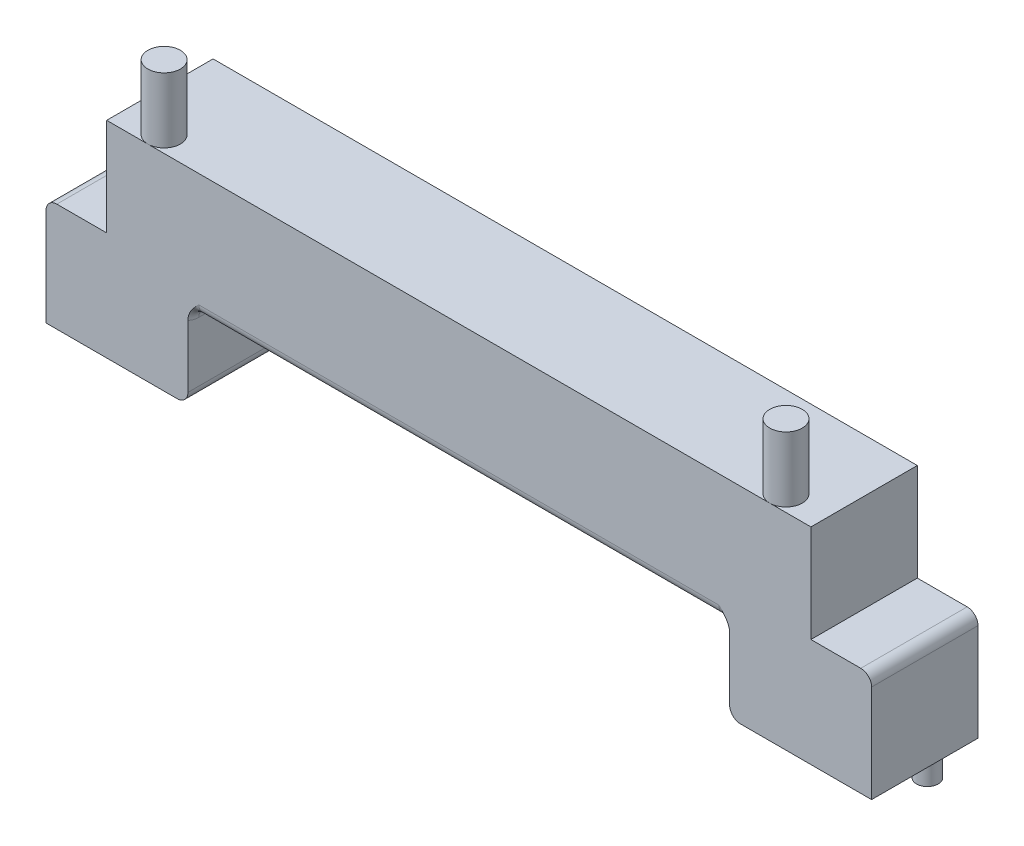
ISO-10303-21;
HEADER;
FILE_DESCRIPTION(('STEP AP214'),'2;1');
FILE_NAME('part.step','',(''),(''),'','','');
FILE_SCHEMA(('AUTOMOTIVE_DESIGN { 1 0 10303 214 1 1 1 1 }'));
ENDSEC;
DATA;
#1=APPLICATION_CONTEXT('core data for automotive mechanical design processes');
#2=APPLICATION_PROTOCOL_DEFINITION('international standard','automotive_design',2000,#1);
#3=PRODUCT_CONTEXT('',#1,'mechanical');
#4=PRODUCT('Part','Part','',(#3));
#5=PRODUCT_RELATED_PRODUCT_CATEGORY('part','',(#4));
#6=PRODUCT_DEFINITION_FORMATION('','',#4);
#7=PRODUCT_DEFINITION_CONTEXT('part definition',#1,'design');
#8=PRODUCT_DEFINITION('design','',#6,#7);
#9=PRODUCT_DEFINITION_SHAPE('','',#8);
#10=(LENGTH_UNIT() NAMED_UNIT(*) SI_UNIT(.MILLI.,.METRE.));
#11=(NAMED_UNIT(*) PLANE_ANGLE_UNIT() SI_UNIT($,.RADIAN.));
#12=(NAMED_UNIT(*) SI_UNIT($,.STERADIAN.) SOLID_ANGLE_UNIT());
#13=UNCERTAINTY_MEASURE_WITH_UNIT(LENGTH_MEASURE(1.E-05),#10,'distance_accuracy_value','');
#14=(GEOMETRIC_REPRESENTATION_CONTEXT(3) GLOBAL_UNCERTAINTY_ASSIGNED_CONTEXT((#13)) GLOBAL_UNIT_ASSIGNED_CONTEXT((#10,
#11,#12)) REPRESENTATION_CONTEXT('',''));
#15=CARTESIAN_POINT('',(0.,0.,0.));
#16=DIRECTION('',(0.,0.,1.));
#17=DIRECTION('',(1.,0.,0.));
#18=AXIS2_PLACEMENT_3D('',#15,#16,#17);
#19=CARTESIAN_POINT('',(63.1,0.,-9.82));
#20=DIRECTION('',(0.,-1.,0.));
#21=DIRECTION('',(0.,0.,-1.));
#22=AXIS2_PLACEMENT_3D('',#19,#20,#21);
#23=PLANE('',#22);
#24=CARTESIAN_POINT('',(73.025,0.,-8.32));
#25=DIRECTION('',(0.,-1.,0.));
#26=DIRECTION('',(0.,0.,-1.));
#27=AXIS2_PLACEMENT_3D('',#24,#25,#26);
#28=CIRCLE('',#27,0.999999999999998);
#29=CARTESIAN_POINT('',(73.025,0.,-9.32));
#30=VERTEX_POINT('',#29);
#31=EDGE_CURVE('E710',#30,#30,#28,.T.);
#32=ORIENTED_EDGE('',*,*,#31,.F.);
#33=EDGE_LOOP('',(#32));
#34=FACE_BOUND('',#33,.T.);
#35=DIRECTION('',(1.,0.,0.));
#36=VECTOR('',#35,1.);
#37=CARTESIAN_POINT('',(63.1,0.,0.));
#38=LINE('',#37,#36);
#39=CARTESIAN_POINT('',(64.1,0.,0.));
#40=VERTEX_POINT('',#39);
#41=CARTESIAN_POINT('',(76.2,0.,0.));
#42=VERTEX_POINT('',#41);
#43=EDGE_CURVE('E441',#40,#42,#38,.T.);
#44=ORIENTED_EDGE('',*,*,#43,.F.);
#45=DIRECTION('',(0.,0.,1.));
#46=VECTOR('',#45,1.);
#47=CARTESIAN_POINT('',(64.1,0.,-9.82));
#48=LINE('',#47,#46);
#49=CARTESIAN_POINT('',(64.1,0.,-9.82));
#50=VERTEX_POINT('',#49);
#51=EDGE_CURVE('E279',#40,#50,#48,.F.);
#52=ORIENTED_EDGE('',*,*,#51,.T.);
#53=DIRECTION('',(1.,0.,0.));
#54=VECTOR('',#53,1.);
#55=CARTESIAN_POINT('',(63.1,0.,-9.82));
#56=LINE('',#55,#54);
#57=CARTESIAN_POINT('',(76.2,0.,-9.82));
#58=VERTEX_POINT('',#57);
#59=EDGE_CURVE('E224',#50,#58,#56,.T.);
#60=ORIENTED_EDGE('',*,*,#59,.T.);
#61=DIRECTION('',(0.,0.,1.));
#62=VECTOR('',#61,1.);
#63=CARTESIAN_POINT('',(76.2,0.,-9.82));
#64=LINE('',#63,#62);
#65=EDGE_CURVE('E239',#58,#42,#64,.T.);
#66=ORIENTED_EDGE('',*,*,#65,.T.);
#67=EDGE_LOOP('',(#44,#52,#60,#66));
#68=FACE_BOUND('',#67,.T.);
#69=ADVANCED_FACE('F41',(#34,#68),#23,.T.);
#70=CARTESIAN_POINT('',(63.1,0.,-9.82));
#71=DIRECTION('',(-1.,0.,0.));
#72=DIRECTION('',(0.,0.,1.));
#73=AXIS2_PLACEMENT_3D('',#70,#71,#72);
#74=PLANE('',#73);
#75=DIRECTION('',(0.,-1.,0.));
#76=VECTOR('',#75,1.);
#77=CARTESIAN_POINT('',(63.1,0.,0.));
#78=LINE('',#77,#76);
#79=CARTESIAN_POINT('',(63.1,6.76794919243112,0.));
#80=VERTEX_POINT('',#79);
#81=CARTESIAN_POINT('',(63.1,1.,0.));
#82=VERTEX_POINT('',#81);
#83=EDGE_CURVE('E222',#80,#82,#78,.T.);
#84=ORIENTED_EDGE('',*,*,#83,.F.);
#85=CARTESIAN_POINT('',(63.1,8.5,-1.));
#86=DIRECTION('',(-1.,0.,0.));
#87=DIRECTION('',(0.,0.,1.));
#88=AXIS2_PLACEMENT_3D('',#85,#86,#87);
#89=CIRCLE('',#88,2.);
#90=CARTESIAN_POINT('',(63.1,6.5,-1.));
#91=VERTEX_POINT('',#90);
#92=EDGE_CURVE('E264',#80,#91,#89,.F.);
#93=ORIENTED_EDGE('',*,*,#92,.T.);
#94=DIRECTION('',(0.,0.,1.));
#95=VECTOR('',#94,1.);
#96=CARTESIAN_POINT('',(63.1,6.5,-9.82));
#97=LINE('',#96,#95);
#98=CARTESIAN_POINT('',(63.1,6.5,-9.82));
#99=VERTEX_POINT('',#98);
#100=EDGE_CURVE('E262',#91,#99,#97,.F.);
#101=ORIENTED_EDGE('',*,*,#100,.T.);
#102=DIRECTION('',(0.,-1.,0.));
#103=VECTOR('',#102,1.);
#104=CARTESIAN_POINT('',(63.1,0.,-9.82));
#105=LINE('',#104,#103);
#106=CARTESIAN_POINT('',(63.1,1.,-9.82));
#107=VERTEX_POINT('',#106);
#108=EDGE_CURVE('E242',#99,#107,#105,.T.);
#109=ORIENTED_EDGE('',*,*,#108,.T.);
#110=DIRECTION('',(0.,0.,1.));
#111=VECTOR('',#110,1.);
#112=CARTESIAN_POINT('',(63.1,1.,-9.82));
#113=LINE('',#112,#111);
#114=EDGE_CURVE('E259',#107,#82,#113,.T.);
#115=ORIENTED_EDGE('',*,*,#114,.T.);
#116=EDGE_LOOP('',(#84,#93,#101,#109,#115));
#117=FACE_BOUND('',#116,.T.);
#118=ADVANCED_FACE('F354',(#117),#74,.T.);
#119=CARTESIAN_POINT('',(13.1,7.5,-9.82));
#120=DIRECTION('',(0.,-1.,0.));
#121=DIRECTION('',(0.,0.,-1.));
#122=AXIS2_PLACEMENT_3D('',#119,#120,#121);
#123=PLANE('',#122);
#124=DIRECTION('',(1.,0.,0.));
#125=VECTOR('',#124,1.);
#126=CARTESIAN_POINT('',(13.1,7.5,-1.));
#127=LINE('',#126,#125);
#128=CARTESIAN_POINT('',(62.1,7.5,-1.));
#129=VERTEX_POINT('',#128);
#130=CARTESIAN_POINT('',(14.1,7.5,-1.));
#131=VERTEX_POINT('',#130);
#132=EDGE_CURVE('E245',#129,#131,#127,.F.);
#133=ORIENTED_EDGE('',*,*,#132,.T.);
#134=DIRECTION('',(0.,0.,1.));
#135=VECTOR('',#134,1.);
#136=CARTESIAN_POINT('',(14.1,7.5,-9.82));
#137=LINE('',#136,#135);
#138=CARTESIAN_POINT('',(14.1,7.5,-9.82));
#139=VERTEX_POINT('',#138);
#140=EDGE_CURVE('E269',#131,#139,#137,.F.);
#141=ORIENTED_EDGE('',*,*,#140,.T.);
#142=DIRECTION('',(1.,0.,0.));
#143=VECTOR('',#142,1.);
#144=CARTESIAN_POINT('',(13.1,7.5,-9.82));
#145=LINE('',#144,#143);
#146=CARTESIAN_POINT('',(62.1,7.5,-9.82));
#147=VERTEX_POINT('',#146);
#148=EDGE_CURVE('E435',#139,#147,#145,.T.);
#149=ORIENTED_EDGE('',*,*,#148,.T.);
#150=DIRECTION('',(0.,0.,1.));
#151=VECTOR('',#150,1.);
#152=CARTESIAN_POINT('',(62.1,7.5,-0.999999999999999));
#153=LINE('',#152,#151);
#154=EDGE_CURVE('E267',#147,#129,#153,.T.);
#155=ORIENTED_EDGE('',*,*,#154,.T.);
#156=EDGE_LOOP('',(#133,#141,#149,#155));
#157=FACE_BOUND('',#156,.T.);
#158=ADVANCED_FACE('F360',(#157),#123,.T.);
#159=CARTESIAN_POINT('',(13.1,0.,-9.82));
#160=DIRECTION('',(1.,0.,0.));
#161=DIRECTION('',(0.,1.,0.));
#162=AXIS2_PLACEMENT_3D('',#159,#160,#161);
#163=PLANE('',#162);
#164=DIRECTION('',(0.,0.,1.));
#165=VECTOR('',#164,1.);
#166=CARTESIAN_POINT('',(13.1,6.5,-0.999999999999999));
#167=LINE('',#166,#165);
#168=CARTESIAN_POINT('',(13.1,6.5,-9.82));
#169=VERTEX_POINT('',#168);
#170=CARTESIAN_POINT('',(13.1,6.5,-1.));
#171=VERTEX_POINT('',#170);
#172=EDGE_CURVE('E250',#169,#171,#167,.T.);
#173=ORIENTED_EDGE('',*,*,#172,.T.);
#174=CARTESIAN_POINT('',(13.1,8.5,-1.));
#175=DIRECTION('',(1.,0.,0.));
#176=DIRECTION('',(0.,1.,0.));
#177=AXIS2_PLACEMENT_3D('',#174,#175,#176);
#178=CIRCLE('',#177,2.);
#179=CARTESIAN_POINT('',(13.1,6.76794919243112,0.));
#180=VERTEX_POINT('',#179);
#181=EDGE_CURVE('E252',#171,#180,#178,.F.);
#182=ORIENTED_EDGE('',*,*,#181,.T.);
#183=DIRECTION('',(0.,1.,0.));
#184=VECTOR('',#183,1.);
#185=CARTESIAN_POINT('',(13.1,0.,0.));
#186=LINE('',#185,#184);
#187=CARTESIAN_POINT('',(13.1,1.,0.));
#188=VERTEX_POINT('',#187);
#189=EDGE_CURVE('E219',#188,#180,#186,.T.);
#190=ORIENTED_EDGE('',*,*,#189,.F.);
#191=DIRECTION('',(0.,0.,1.));
#192=VECTOR('',#191,1.);
#193=CARTESIAN_POINT('',(13.1,1.,-9.82));
#194=LINE('',#193,#192);
#195=CARTESIAN_POINT('',(13.1,1.,-9.82));
#196=VERTEX_POINT('',#195);
#197=EDGE_CURVE('E248',#188,#196,#194,.F.);
#198=ORIENTED_EDGE('',*,*,#197,.T.);
#199=DIRECTION('',(0.,1.,0.));
#200=VECTOR('',#199,1.);
#201=CARTESIAN_POINT('',(13.1,0.,-9.82));
#202=LINE('',#201,#200);
#203=EDGE_CURVE('E437',#196,#169,#202,.T.);
#204=ORIENTED_EDGE('',*,*,#203,.T.);
#205=EDGE_LOOP('',(#173,#182,#190,#198,#204));
#206=FACE_BOUND('',#205,.T.);
#207=ADVANCED_FACE('F394',(#206),#163,.T.);
#208=CARTESIAN_POINT('',(0.,0.,-9.82));
#209=DIRECTION('',(0.,-1.,0.));
#210=DIRECTION('',(0.,0.,-1.));
#211=AXIS2_PLACEMENT_3D('',#208,#209,#210);
#212=PLANE('',#211);
#213=CARTESIAN_POINT('',(3.175,0.,-8.32));
#214=DIRECTION('',(0.,-1.,0.));
#215=DIRECTION('',(0.,0.,1.));
#216=AXIS2_PLACEMENT_3D('',#213,#214,#215);
#217=CIRCLE('',#216,0.999999999999998);
#218=CARTESIAN_POINT('',(3.175,0.,-7.32));
#219=VERTEX_POINT('',#218);
#220=EDGE_CURVE('E419',#219,#219,#217,.T.);
#221=ORIENTED_EDGE('',*,*,#220,.F.);
#222=EDGE_LOOP('',(#221));
#223=FACE_BOUND('',#222,.T.);
#224=DIRECTION('',(1.,0.,0.));
#225=VECTOR('',#224,1.);
#226=CARTESIAN_POINT('',(0.,0.,-9.82));
#227=LINE('',#226,#225);
#228=CARTESIAN_POINT('',(0.,0.,-9.82));
#229=VERTEX_POINT('',#228);
#230=CARTESIAN_POINT('',(12.1,0.,-9.82));
#231=VERTEX_POINT('',#230);
#232=EDGE_CURVE('E469',#229,#231,#227,.T.);
#233=ORIENTED_EDGE('',*,*,#232,.T.);
#234=DIRECTION('',(0.,0.,1.));
#235=VECTOR('',#234,1.);
#236=CARTESIAN_POINT('',(12.1,0.,-9.82));
#237=LINE('',#236,#235);
#238=CARTESIAN_POINT('',(12.1,0.,0.));
#239=VERTEX_POINT('',#238);
#240=EDGE_CURVE('E288',#231,#239,#237,.T.);
#241=ORIENTED_EDGE('',*,*,#240,.T.);
#242=DIRECTION('',(1.,0.,0.));
#243=VECTOR('',#242,1.);
#244=CARTESIAN_POINT('',(0.,0.,0.));
#245=LINE('',#244,#243);
#246=CARTESIAN_POINT('',(0.,0.,0.));
#247=VERTEX_POINT('',#246);
#248=EDGE_CURVE('E216',#247,#239,#245,.T.);
#249=ORIENTED_EDGE('',*,*,#248,.F.);
#250=DIRECTION('',(0.,0.,1.));
#251=VECTOR('',#250,1.);
#252=CARTESIAN_POINT('',(0.,0.,-9.82));
#253=LINE('',#252,#251);
#254=EDGE_CURVE('E225',#229,#247,#253,.T.);
#255=ORIENTED_EDGE('',*,*,#254,.F.);
#256=EDGE_LOOP('',(#233,#241,#249,#255));
#257=FACE_BOUND('',#256,.T.);
#258=ADVANCED_FACE('F390',(#223,#257),#212,.T.);
#259=CARTESIAN_POINT('',(0.,10.,-9.82));
#260=DIRECTION('',(-1.,0.,0.));
#261=DIRECTION('',(0.,-1.,0.));
#262=AXIS2_PLACEMENT_3D('',#259,#260,#261);
#263=PLANE('',#262);
#264=DIRECTION('',(0.,-1.,0.));
#265=VECTOR('',#264,1.);
#266=CARTESIAN_POINT('',(0.,10.,0.));
#267=LINE('',#266,#265);
#268=CARTESIAN_POINT('',(0.,9.,0.));
#269=VERTEX_POINT('',#268);
#270=EDGE_CURVE('E214',#269,#247,#267,.T.);
#271=ORIENTED_EDGE('',*,*,#270,.F.);
#272=DIRECTION('',(0.,0.,1.));
#273=VECTOR('',#272,1.);
#274=CARTESIAN_POINT('',(0.,9.,-9.82));
#275=LINE('',#274,#273);
#276=CARTESIAN_POINT('',(0.,9.,-9.82));
#277=VERTEX_POINT('',#276);
#278=EDGE_CURVE('E294',#269,#277,#275,.F.);
#279=ORIENTED_EDGE('',*,*,#278,.T.);
#280=DIRECTION('',(0.,-1.,0.));
#281=VECTOR('',#280,1.);
#282=CARTESIAN_POINT('',(0.,10.,-9.82));
#283=LINE('',#282,#281);
#284=EDGE_CURVE('E467',#277,#229,#283,.T.);
#285=ORIENTED_EDGE('',*,*,#284,.T.);
#286=ORIENTED_EDGE('',*,*,#254,.T.);
#287=EDGE_LOOP('',(#271,#279,#285,#286));
#288=FACE_BOUND('',#287,.T.);
#289=ADVANCED_FACE('F386',(#288),#263,.T.);
#290=CARTESIAN_POINT('',(0.,10.,-9.82));
#291=DIRECTION('',(0.,1.,0.));
#292=DIRECTION('',(0.,0.,1.));
#293=AXIS2_PLACEMENT_3D('',#290,#291,#292);
#294=PLANE('',#293);
#295=DIRECTION('',(-1.,0.,0.));
#296=VECTOR('',#295,1.);
#297=CARTESIAN_POINT('',(0.,10.,-9.82));
#298=LINE('',#297,#296);
#299=CARTESIAN_POINT('',(5.6,10.,-9.82));
#300=VERTEX_POINT('',#299);
#301=CARTESIAN_POINT('',(0.999999999999998,10.,-9.82));
#302=VERTEX_POINT('',#301);
#303=EDGE_CURVE('E460',#300,#302,#298,.T.);
#304=ORIENTED_EDGE('',*,*,#303,.T.);
#305=DIRECTION('',(0.,0.,1.));
#306=VECTOR('',#305,1.);
#307=CARTESIAN_POINT('',(0.999999999999998,10.,-9.82));
#308=LINE('',#307,#306);
#309=CARTESIAN_POINT('',(0.999999999999998,10.,0.));
#310=VERTEX_POINT('',#309);
#311=EDGE_CURVE('E291',#302,#310,#308,.T.);
#312=ORIENTED_EDGE('',*,*,#311,.T.);
#313=DIRECTION('',(-1.,0.,0.));
#314=VECTOR('',#313,1.);
#315=CARTESIAN_POINT('',(0.,10.,0.));
#316=LINE('',#315,#314);
#317=CARTESIAN_POINT('',(5.6,10.,0.));
#318=VERTEX_POINT('',#317);
#319=EDGE_CURVE('E211',#318,#310,#316,.T.);
#320=ORIENTED_EDGE('',*,*,#319,.F.);
#321=DIRECTION('',(0.,0.,1.));
#322=VECTOR('',#321,1.);
#323=CARTESIAN_POINT('',(5.6,10.,-9.82));
#324=LINE('',#323,#322);
#325=EDGE_CURVE('E229',#300,#318,#324,.T.);
#326=ORIENTED_EDGE('',*,*,#325,.F.);
#327=EDGE_LOOP('',(#304,#312,#320,#326));
#328=FACE_BOUND('',#327,.T.);
#329=ADVANCED_FACE('F382',(#328),#294,.T.);
#330=CARTESIAN_POINT('',(5.6,10.,-9.82));
#331=DIRECTION('',(-1.,0.,0.));
#332=DIRECTION('',(0.,0.,1.));
#333=AXIS2_PLACEMENT_3D('',#330,#331,#332);
#334=PLANE('',#333);
#335=DIRECTION('',(0.,-1.,0.));
#336=VECTOR('',#335,1.);
#337=CARTESIAN_POINT('',(5.6,10.,0.));
#338=LINE('',#337,#336);
#339=CARTESIAN_POINT('',(5.6,19.,0.));
#340=VERTEX_POINT('',#339);
#341=EDGE_CURVE('E197',#340,#318,#338,.T.);
#342=ORIENTED_EDGE('',*,*,#341,.F.);
#343=DIRECTION('',(0.,0.,1.));
#344=VECTOR('',#343,1.);
#345=CARTESIAN_POINT('',(5.6,19.,-9.82));
#346=LINE('',#345,#344);
#347=CARTESIAN_POINT('',(5.6,19.,-9.82));
#348=VERTEX_POINT('',#347);
#349=EDGE_CURVE('E231',#348,#340,#346,.T.);
#350=ORIENTED_EDGE('',*,*,#349,.F.);
#351=DIRECTION('',(0.,-1.,0.));
#352=VECTOR('',#351,1.);
#353=CARTESIAN_POINT('',(5.6,10.,-9.82));
#354=LINE('',#353,#352);
#355=EDGE_CURVE('E458',#348,#300,#354,.T.);
#356=ORIENTED_EDGE('',*,*,#355,.T.);
#357=ORIENTED_EDGE('',*,*,#325,.T.);
#358=EDGE_LOOP('',(#342,#350,#356,#357));
#359=FACE_BOUND('',#358,.T.);
#360=ADVANCED_FACE('F379',(#359),#334,.T.);
#361=CARTESIAN_POINT('',(5.6,19.,-9.82));
#362=DIRECTION('',(0.,1.,0.));
#363=DIRECTION('',(0.,0.,1.));
#364=AXIS2_PLACEMENT_3D('',#361,#362,#363);
#365=PLANE('',#364);
#366=DIRECTION('',(-1.,0.,0.));
#367=VECTOR('',#366,1.);
#368=CARTESIAN_POINT('',(5.6,19.,0.));
#369=LINE('',#368,#367);
#370=CARTESIAN_POINT('',(9.4,19.,0.));
#371=VERTEX_POINT('',#370);
#372=EDGE_CURVE('E199',#371,#340,#369,.T.);
#373=ORIENTED_EDGE('',*,*,#372,.F.);
#374=CARTESIAN_POINT('',(9.4,19.,-1.5));
#375=DIRECTION('',(0.,1.,0.));
#376=DIRECTION('',(0.,0.,1.));
#377=AXIS2_PLACEMENT_3D('',#374,#375,#376);
#378=CIRCLE('',#377,1.5);
#379=EDGE_CURVE('E205',#371,#371,#378,.T.);
#380=ORIENTED_EDGE('',*,*,#379,.F.);
#381=CARTESIAN_POINT('',(66.8,19.,0.));
#382=VERTEX_POINT('',#381);
#383=EDGE_CURVE('E191',#382,#371,#369,.T.);
#384=ORIENTED_EDGE('',*,*,#383,.F.);
#385=CARTESIAN_POINT('',(66.8,19.,-1.5));
#386=DIRECTION('',(0.,1.,0.));
#387=DIRECTION('',(0.,0.,-1.));
#388=AXIS2_PLACEMENT_3D('',#385,#386,#387);
#389=CIRCLE('',#388,1.50000000000001);
#390=EDGE_CURVE('E203',#382,#382,#389,.T.);
#391=ORIENTED_EDGE('',*,*,#390,.F.);
#392=CARTESIAN_POINT('',(70.6,19.,0.));
#393=VERTEX_POINT('',#392);
#394=EDGE_CURVE('E187',#393,#382,#369,.T.);
#395=ORIENTED_EDGE('',*,*,#394,.F.);
#396=DIRECTION('',(0.,0.,1.));
#397=VECTOR('',#396,1.);
#398=CARTESIAN_POINT('',(70.6,19.,-9.82));
#399=LINE('',#398,#397);
#400=CARTESIAN_POINT('',(70.6,19.,-9.82));
#401=VERTEX_POINT('',#400);
#402=EDGE_CURVE('E234',#401,#393,#399,.T.);
#403=ORIENTED_EDGE('',*,*,#402,.F.);
#404=DIRECTION('',(-1.,0.,0.));
#405=VECTOR('',#404,1.);
#406=CARTESIAN_POINT('',(5.6,19.,-9.82));
#407=LINE('',#406,#405);
#408=EDGE_CURVE('E454',#401,#348,#407,.T.);
#409=ORIENTED_EDGE('',*,*,#408,.T.);
#410=ORIENTED_EDGE('',*,*,#349,.T.);
#411=EDGE_LOOP('',(#373,#380,#384,#391,#395,#403,#409,#410));
#412=FACE_BOUND('',#411,.T.);
#413=ADVANCED_FACE('F201',(#412),#365,.T.);
#414=CARTESIAN_POINT('',(70.6,19.,-9.82));
#415=DIRECTION('',(1.,0.,0.));
#416=DIRECTION('',(0.,0.,-1.));
#417=AXIS2_PLACEMENT_3D('',#414,#415,#416);
#418=PLANE('',#417);
#419=DIRECTION('',(0.,1.,0.));
#420=VECTOR('',#419,1.);
#421=CARTESIAN_POINT('',(70.6,19.,0.));
#422=LINE('',#421,#420);
#423=CARTESIAN_POINT('',(70.6,10.,0.));
#424=VERTEX_POINT('',#423);
#425=EDGE_CURVE('E194',#424,#393,#422,.T.);
#426=ORIENTED_EDGE('',*,*,#425,.F.);
#427=DIRECTION('',(0.,0.,1.));
#428=VECTOR('',#427,1.);
#429=CARTESIAN_POINT('',(70.6,10.,-9.82));
#430=LINE('',#429,#428);
#431=CARTESIAN_POINT('',(70.6,10.,-9.82));
#432=VERTEX_POINT('',#431);
#433=EDGE_CURVE('E236',#432,#424,#430,.T.);
#434=ORIENTED_EDGE('',*,*,#433,.F.);
#435=DIRECTION('',(0.,1.,0.));
#436=VECTOR('',#435,1.);
#437=CARTESIAN_POINT('',(70.6,19.,-9.82));
#438=LINE('',#437,#436);
#439=EDGE_CURVE('E451',#432,#401,#438,.T.);
#440=ORIENTED_EDGE('',*,*,#439,.T.);
#441=ORIENTED_EDGE('',*,*,#402,.T.);
#442=EDGE_LOOP('',(#426,#434,#440,#441));
#443=FACE_BOUND('',#442,.T.);
#444=ADVANCED_FACE('F373',(#443),#418,.T.);
#445=CARTESIAN_POINT('',(70.6,10.,-9.82));
#446=DIRECTION('',(0.,1.,0.));
#447=DIRECTION('',(0.,0.,1.));
#448=AXIS2_PLACEMENT_3D('',#445,#446,#447);
#449=PLANE('',#448);
#450=DIRECTION('',(-1.,0.,0.));
#451=VECTOR('',#450,1.);
#452=CARTESIAN_POINT('',(70.6,10.,0.));
#453=LINE('',#452,#451);
#454=CARTESIAN_POINT('',(75.2,10.,0.));
#455=VERTEX_POINT('',#454);
#456=EDGE_CURVE('E446',#455,#424,#453,.T.);
#457=ORIENTED_EDGE('',*,*,#456,.F.);
#458=DIRECTION('',(0.,0.,1.));
#459=VECTOR('',#458,1.);
#460=CARTESIAN_POINT('',(75.2,10.,-9.82));
#461=LINE('',#460,#459);
#462=CARTESIAN_POINT('',(75.2,10.,-9.82));
#463=VERTEX_POINT('',#462);
#464=EDGE_CURVE('E66',#455,#463,#461,.F.);
#465=ORIENTED_EDGE('',*,*,#464,.T.);
#466=DIRECTION('',(-1.,0.,0.));
#467=VECTOR('',#466,1.);
#468=CARTESIAN_POINT('',(70.6,10.,-9.82));
#469=LINE('',#468,#467);
#470=EDGE_CURVE('E448',#463,#432,#469,.T.);
#471=ORIENTED_EDGE('',*,*,#470,.T.);
#472=ORIENTED_EDGE('',*,*,#433,.T.);
#473=EDGE_LOOP('',(#457,#465,#471,#472));
#474=FACE_BOUND('',#473,.T.);
#475=ADVANCED_FACE('F369',(#474),#449,.T.);
#476=CARTESIAN_POINT('',(76.2,10.,-9.82));
#477=DIRECTION('',(1.,0.,0.));
#478=DIRECTION('',(0.,0.,-1.));
#479=AXIS2_PLACEMENT_3D('',#476,#477,#478);
#480=PLANE('',#479);
#481=DIRECTION('',(0.,1.,0.));
#482=VECTOR('',#481,1.);
#483=CARTESIAN_POINT('',(76.2,10.,-9.82));
#484=LINE('',#483,#482);
#485=CARTESIAN_POINT('',(76.2,9.,-9.82));
#486=VERTEX_POINT('',#485);
#487=EDGE_CURVE('E715',#58,#486,#484,.T.);
#488=ORIENTED_EDGE('',*,*,#487,.T.);
#489=DIRECTION('',(0.,0.,1.));
#490=VECTOR('',#489,1.);
#491=CARTESIAN_POINT('',(76.2,9.,-9.82));
#492=LINE('',#491,#490);
#493=CARTESIAN_POINT('',(76.2,9.,0.));
#494=VERTEX_POINT('',#493);
#495=EDGE_CURVE('E296',#486,#494,#492,.T.);
#496=ORIENTED_EDGE('',*,*,#495,.T.);
#497=DIRECTION('',(0.,1.,0.));
#498=VECTOR('',#497,1.);
#499=CARTESIAN_POINT('',(76.2,10.,0.));
#500=LINE('',#499,#498);
#501=EDGE_CURVE('E443',#42,#494,#500,.T.);
#502=ORIENTED_EDGE('',*,*,#501,.F.);
#503=ORIENTED_EDGE('',*,*,#65,.F.);
#504=EDGE_LOOP('',(#488,#496,#502,#503));
#505=FACE_BOUND('',#504,.T.);
#506=ADVANCED_FACE('F365',(#505),#480,.T.);
#507=CARTESIAN_POINT('',(0.,0.,-9.82));
#508=DIRECTION('',(0.,0.,-1.));
#509=DIRECTION('',(-1.,0.,0.));
#510=AXIS2_PLACEMENT_3D('',#507,#508,#509);
#511=PLANE('',#510);
#512=ORIENTED_EDGE('',*,*,#59,.F.);
#513=CARTESIAN_POINT('',(64.1,1.,-9.82));
#514=DIRECTION('',(0.,0.,-1.));
#515=DIRECTION('',(-1.,0.,0.));
#516=AXIS2_PLACEMENT_3D('',#513,#514,#515);
#517=CIRCLE('',#516,1.);
#518=EDGE_CURVE('E286',#50,#107,#517,.T.);
#519=ORIENTED_EDGE('',*,*,#518,.T.);
#520=ORIENTED_EDGE('',*,*,#108,.F.);
#521=CARTESIAN_POINT('',(62.1,6.5,-9.82));
#522=DIRECTION('',(0.,0.,-1.));
#523=DIRECTION('',(-1.,0.,0.));
#524=AXIS2_PLACEMENT_3D('',#521,#522,#523);
#525=CIRCLE('',#524,1.);
#526=EDGE_CURVE('E11',#99,#147,#525,.F.);
#527=ORIENTED_EDGE('',*,*,#526,.T.);
#528=ORIENTED_EDGE('',*,*,#148,.F.);
#529=CARTESIAN_POINT('',(14.1,6.5,-9.82));
#530=DIRECTION('',(0.,0.,-1.));
#531=DIRECTION('',(-1.,0.,0.));
#532=AXIS2_PLACEMENT_3D('',#529,#530,#531);
#533=CIRCLE('',#532,1.);
#534=EDGE_CURVE('E50',#139,#169,#533,.F.);
#535=ORIENTED_EDGE('',*,*,#534,.T.);
#536=ORIENTED_EDGE('',*,*,#203,.F.);
#537=CARTESIAN_POINT('',(12.1,1.,-9.82));
#538=DIRECTION('',(0.,0.,-1.));
#539=DIRECTION('',(-1.,0.,0.));
#540=AXIS2_PLACEMENT_3D('',#537,#538,#539);
#541=CIRCLE('',#540,1.);
#542=EDGE_CURVE('E284',#196,#231,#541,.T.);
#543=ORIENTED_EDGE('',*,*,#542,.T.);
#544=ORIENTED_EDGE('',*,*,#232,.F.);
#545=ORIENTED_EDGE('',*,*,#284,.F.);
#546=CARTESIAN_POINT('',(0.999999999999998,9.,-9.82));
#547=DIRECTION('',(0.,0.,-1.));
#548=DIRECTION('',(-1.,0.,0.));
#549=AXIS2_PLACEMENT_3D('',#546,#547,#548);
#550=CIRCLE('',#549,1.);
#551=EDGE_CURVE('E282',#277,#302,#550,.T.);
#552=ORIENTED_EDGE('',*,*,#551,.T.);
#553=ORIENTED_EDGE('',*,*,#303,.F.);
#554=ORIENTED_EDGE('',*,*,#355,.F.);
#555=ORIENTED_EDGE('',*,*,#408,.F.);
#556=ORIENTED_EDGE('',*,*,#439,.F.);
#557=ORIENTED_EDGE('',*,*,#470,.F.);
#558=CARTESIAN_POINT('',(75.2,9.,-9.82));
#559=DIRECTION('',(0.,0.,-1.));
#560=DIRECTION('',(-1.,0.,0.));
#561=AXIS2_PLACEMENT_3D('',#558,#559,#560);
#562=CIRCLE('',#561,1.);
#563=EDGE_CURVE('E58',#463,#486,#562,.T.);
#564=ORIENTED_EDGE('',*,*,#563,.T.);
#565=ORIENTED_EDGE('',*,*,#487,.F.);
#566=EDGE_LOOP('',(#512,#519,#520,#527,#528,#535,#536,#543,#544,#545,#552,#553,#554,#555,#556,
#557,#564,#565));
#567=FACE_BOUND('',#566,.T.);
#568=ADVANCED_FACE('F368',(#567),#511,.T.);
#569=CARTESIAN_POINT('',(0.,0.,0.));
#570=DIRECTION('',(0.,0.,-1.));
#571=DIRECTION('',(-1.,0.,0.));
#572=AXIS2_PLACEMENT_3D('',#569,#570,#571);
#573=PLANE('',#572);
#574=ORIENTED_EDGE('',*,*,#83,.T.);
#575=CARTESIAN_POINT('',(64.1,1.,0.));
#576=DIRECTION('',(0.,0.,-1.));
#577=DIRECTION('',(-1.,0.,0.));
#578=AXIS2_PLACEMENT_3D('',#575,#576,#577);
#579=CIRCLE('',#578,1.);
#580=EDGE_CURVE('E277',#82,#40,#579,.F.);
#581=ORIENTED_EDGE('',*,*,#580,.T.);
#582=ORIENTED_EDGE('',*,*,#43,.T.);
#583=ORIENTED_EDGE('',*,*,#501,.T.);
#584=CARTESIAN_POINT('',(75.2,9.,0.));
#585=DIRECTION('',(0.,0.,-1.));
#586=DIRECTION('',(-1.,0.,0.));
#587=AXIS2_PLACEMENT_3D('',#584,#585,#586);
#588=CIRCLE('',#587,1.);
#589=EDGE_CURVE('E271',#494,#455,#588,.F.);
#590=ORIENTED_EDGE('',*,*,#589,.T.);
#591=ORIENTED_EDGE('',*,*,#456,.T.);
#592=ORIENTED_EDGE('',*,*,#425,.T.);
#593=ORIENTED_EDGE('',*,*,#394,.T.);
#594=ORIENTED_EDGE('',*,*,#383,.T.);
#595=ORIENTED_EDGE('',*,*,#372,.T.);
#596=ORIENTED_EDGE('',*,*,#341,.T.);
#597=ORIENTED_EDGE('',*,*,#319,.T.);
#598=CARTESIAN_POINT('',(0.999999999999998,9.,0.));
#599=DIRECTION('',(0.,0.,-1.));
#600=DIRECTION('',(-1.,0.,0.));
#601=AXIS2_PLACEMENT_3D('',#598,#599,#600);
#602=CIRCLE('',#601,1.);
#603=EDGE_CURVE('E273',#310,#269,#602,.F.);
#604=ORIENTED_EDGE('',*,*,#603,.T.);
#605=ORIENTED_EDGE('',*,*,#270,.T.);
#606=ORIENTED_EDGE('',*,*,#248,.T.);
#607=CARTESIAN_POINT('',(12.1,1.,0.));
#608=DIRECTION('',(0.,0.,-1.));
#609=DIRECTION('',(-1.,0.,0.));
#610=AXIS2_PLACEMENT_3D('',#607,#608,#609);
#611=CIRCLE('',#610,1.);
#612=EDGE_CURVE('E275',#239,#188,#611,.F.);
#613=ORIENTED_EDGE('',*,*,#612,.T.);
#614=ORIENTED_EDGE('',*,*,#189,.T.);
#615=CARTESIAN_POINT('',(13.1,6.76794919243112,0.));
#616=CARTESIAN_POINT('',(13.099997196387,6.81080472130723,0.));
#617=CARTESIAN_POINT('',(13.102066027665,6.85362337807941,0.));
#618=CARTESIAN_POINT('',(13.11007196565,6.93883548824204,0.));
#619=CARTESIAN_POINT('',(13.1160031855693,6.98122948918313,0.));
#620=CARTESIAN_POINT('',(13.1389948978127,7.10638680524595,0.));
#621=CARTESIAN_POINT('',(13.1612681270059,7.18821544238512,0.));
#622=CARTESIAN_POINT('',(13.2279013404587,7.37735831296114,0.));
#623=CARTESIAN_POINT('',(13.2773963354962,7.48282301219986,0.));
#624=CARTESIAN_POINT('',(13.3923048434429,7.68509057972953,0.));
#625=CARTESIAN_POINT('',(13.4578057821785,7.78184174054053,0.));
#626=CARTESIAN_POINT('',(13.6134206548818,7.98628124592828,0.));
#627=CARTESIAN_POINT('',(13.7058293681552,8.09216920660506,0.));
#628=CARTESIAN_POINT('',(13.8973240320005,8.29722762958855,0.));
#629=CARTESIAN_POINT('',(13.9964047065227,8.3964032782475,0.));
#630=CARTESIAN_POINT('',(14.0970185776462,8.49701857642893,0.));
#631=CARTESIAN_POINT('',(14.098509289678,8.49850928844189,0.));
#632=CARTESIAN_POINT('',(14.1,8.5,0.));
#633=B_SPLINE_CURVE_WITH_KNOTS('',3,(#615,#616,#617,#618,#619,#620,#621,#622,#623,#624,#625,
#626,#627,#628,#629,#630,#631,#632),.UNSPECIFIED.,.F.,.F.,(4,2,2,2,2,2,2,2,4),(0.,
0.128456249212726,0.25671717102298,0.510014180776442,0.857583473002376,1.20709540467852,
1.62797108908905,2.04851777580516,2.05484233112552),.UNSPECIFIED.);
#634=CARTESIAN_POINT('',(14.1,8.5,0.));
#635=VERTEX_POINT('',#634);
#636=EDGE_CURVE('E300',#180,#635,#633,.T.);
#637=ORIENTED_EDGE('',*,*,#636,.T.);
#638=DIRECTION('',(1.,0.,0.));
#639=VECTOR('',#638,1.);
#640=CARTESIAN_POINT('',(63.1,8.5,0.));
#641=LINE('',#640,#639);
#642=CARTESIAN_POINT('',(62.1,8.5,0.));
#643=VERTEX_POINT('',#642);
#644=EDGE_CURVE('E228',#635,#643,#641,.T.);
#645=ORIENTED_EDGE('',*,*,#644,.T.);
#646=CARTESIAN_POINT('',(63.1,6.76794919243112,0.));
#647=CARTESIAN_POINT('',(63.100002803613,6.81080472130723,0.));
#648=CARTESIAN_POINT('',(63.097933972335,6.8536233780794,0.));
#649=CARTESIAN_POINT('',(63.08992803435,6.93883548824202,0.));
#650=CARTESIAN_POINT('',(63.0839968144307,6.98122948918311,0.));
#651=CARTESIAN_POINT('',(63.0610051021873,7.10638680524593,0.));
#652=CARTESIAN_POINT('',(63.0387318729941,7.18821544238511,0.));
#653=CARTESIAN_POINT('',(62.9720986595413,7.37735831296115,0.));
#654=CARTESIAN_POINT('',(62.9226036645038,7.4828230121999,0.));
#655=CARTESIAN_POINT('',(62.807695156557,7.68509057972956,0.));
#656=CARTESIAN_POINT('',(62.7421942178215,7.78184174054053,0.));
#657=CARTESIAN_POINT('',(62.5865793451182,7.98628124592831,0.));
#658=CARTESIAN_POINT('',(62.4941706318449,8.09216920660514,0.));
#659=CARTESIAN_POINT('',(62.3026759679994,8.29722762958847,0.));
#660=CARTESIAN_POINT('',(62.2035952934769,8.39640327824719,0.));
#661=CARTESIAN_POINT('',(62.1029814223537,8.49701857642892,0.));
#662=CARTESIAN_POINT('',(62.101490710322,8.49850928844189,0.));
#663=CARTESIAN_POINT('',(62.1,8.5,0.));
#664=B_SPLINE_CURVE_WITH_KNOTS('',3,(#646,#647,#648,#649,#650,#651,#652,#653,#654,#655,#656,
#657,#658,#659,#660,#661,#662,#663),.UNSPECIFIED.,.F.,.F.,(4,2,2,2,2,2,2,2,4),(0.,
0.128456249212709,0.256717171022949,0.510014180776443,0.857583473002414,1.20709540467854,
1.62797108908905,2.04851777580517,2.05484233112552),.UNSPECIFIED.);
#665=EDGE_CURVE('E308',#643,#80,#664,.F.);
#666=ORIENTED_EDGE('',*,*,#665,.T.);
#667=EDGE_LOOP('',(#574,#581,#582,#583,#590,#591,#592,#593,#594,#595,#596,#597,#604,#605,#606,
#613,#614,#637,#645,#666));
#668=FACE_BOUND('',#667,.T.);
#669=ADVANCED_FACE('F190',(#668),#573,.F.);
#670=CARTESIAN_POINT('',(66.8,25.,-1.5));
#671=DIRECTION('',(0.,-1.,0.));
#672=DIRECTION('',(0.,0.,-1.));
#673=AXIS2_PLACEMENT_3D('',#670,#671,#672);
#674=CYLINDRICAL_SURFACE('',#673,1.50000000000001);
#675=CARTESIAN_POINT('',(66.8,25.,-1.5));
#676=DIRECTION('',(0.,1.,0.));
#677=DIRECTION('',(0.,0.,-1.));
#678=AXIS2_PLACEMENT_3D('',#675,#676,#677);
#679=CIRCLE('',#678,1.50000000000001);
#680=CARTESIAN_POINT('',(66.8,25.,-3.00000000000001));
#681=VERTEX_POINT('',#680);
#682=EDGE_CURVE('E706',#681,#681,#679,.T.);
#683=ORIENTED_EDGE('',*,*,#682,.F.);
#684=EDGE_LOOP('',(#683));
#685=FACE_BOUND('',#684,.T.);
#686=ORIENTED_EDGE('',*,*,#390,.T.);
#687=EDGE_LOOP('',(#686));
#688=FACE_BOUND('',#687,.T.);
#689=ADVANCED_FACE('F517',(#685,#688),#674,.T.);
#690=CARTESIAN_POINT('',(66.8,25.,-1.5));
#691=DIRECTION('',(0.,-1.,0.));
#692=DIRECTION('',(0.,0.,-1.));
#693=AXIS2_PLACEMENT_3D('',#690,#691,#692);
#694=PLANE('',#693);
#695=ORIENTED_EDGE('',*,*,#682,.T.);
#696=EDGE_LOOP('',(#695));
#697=FACE_BOUND('',#696,.T.);
#698=ADVANCED_FACE('F515',(#697),#694,.F.);
#699=CARTESIAN_POINT('',(9.4,25.,-1.5));
#700=DIRECTION('',(0.,-1.,0.));
#701=DIRECTION('',(0.,0.,-1.));
#702=AXIS2_PLACEMENT_3D('',#699,#700,#701);
#703=CYLINDRICAL_SURFACE('',#702,1.5);
#704=CARTESIAN_POINT('',(9.4,25.,-1.5));
#705=DIRECTION('',(0.,1.,0.));
#706=DIRECTION('',(0.,0.,1.));
#707=AXIS2_PLACEMENT_3D('',#704,#705,#706);
#708=CIRCLE('',#707,1.5);
#709=CARTESIAN_POINT('',(9.4,25.,0.));
#710=VERTEX_POINT('',#709);
#711=EDGE_CURVE('E444',#710,#710,#708,.T.);
#712=ORIENTED_EDGE('',*,*,#711,.F.);
#713=EDGE_LOOP('',(#712));
#714=FACE_BOUND('',#713,.T.);
#715=ORIENTED_EDGE('',*,*,#379,.T.);
#716=EDGE_LOOP('',(#715));
#717=FACE_BOUND('',#716,.T.);
#718=ADVANCED_FACE('F511',(#714,#717),#703,.T.);
#719=CARTESIAN_POINT('',(9.4,25.,-1.5));
#720=DIRECTION('',(0.,1.,0.));
#721=DIRECTION('',(0.,0.,1.));
#722=AXIS2_PLACEMENT_3D('',#719,#720,#721);
#723=PLANE('',#722);
#724=ORIENTED_EDGE('',*,*,#711,.T.);
#725=EDGE_LOOP('',(#724));
#726=FACE_BOUND('',#725,.T.);
#727=ADVANCED_FACE('F504',(#726),#723,.T.);
#728=CARTESIAN_POINT('',(3.175,-4.,-8.32));
#729=DIRECTION('',(0.,1.,0.));
#730=DIRECTION('',(0.,0.,1.));
#731=AXIS2_PLACEMENT_3D('',#728,#729,#730);
#732=CYLINDRICAL_SURFACE('',#731,0.999999999999998);
#733=CARTESIAN_POINT('',(3.175,-4.,-8.32));
#734=DIRECTION('',(0.,-1.,0.));
#735=DIRECTION('',(0.,0.,1.));
#736=AXIS2_PLACEMENT_3D('',#733,#734,#735);
#737=CIRCLE('',#736,0.999999999999998);
#738=CARTESIAN_POINT('',(3.175,-4.,-7.32));
#739=VERTEX_POINT('',#738);
#740=EDGE_CURVE('E417',#739,#739,#737,.T.);
#741=ORIENTED_EDGE('',*,*,#740,.F.);
#742=EDGE_LOOP('',(#741));
#743=FACE_BOUND('',#742,.T.);
#744=ORIENTED_EDGE('',*,*,#220,.T.);
#745=EDGE_LOOP('',(#744));
#746=FACE_BOUND('',#745,.T.);
#747=ADVANCED_FACE('F501',(#743,#746),#732,.T.);
#748=CARTESIAN_POINT('',(3.175,-4.,-8.32));
#749=DIRECTION('',(0.,1.,0.));
#750=DIRECTION('',(0.,0.,1.));
#751=AXIS2_PLACEMENT_3D('',#748,#749,#750);
#752=PLANE('',#751);
#753=ORIENTED_EDGE('',*,*,#740,.T.);
#754=EDGE_LOOP('',(#753));
#755=FACE_BOUND('',#754,.T.);
#756=ADVANCED_FACE('F496',(#755),#752,.F.);
#757=CARTESIAN_POINT('',(73.025,-4.,-8.32));
#758=DIRECTION('',(0.,1.,0.));
#759=DIRECTION('',(0.,0.,1.));
#760=AXIS2_PLACEMENT_3D('',#757,#758,#759);
#761=CYLINDRICAL_SURFACE('',#760,0.999999999999998);
#762=CARTESIAN_POINT('',(73.025,-4.,-8.32));
#763=DIRECTION('',(0.,-1.,0.));
#764=DIRECTION('',(0.,0.,-1.));
#765=AXIS2_PLACEMENT_3D('',#762,#763,#764);
#766=CIRCLE('',#765,0.999999999999998);
#767=CARTESIAN_POINT('',(73.025,-4.,-9.32));
#768=VERTEX_POINT('',#767);
#769=EDGE_CURVE('E707',#768,#768,#766,.T.);
#770=ORIENTED_EDGE('',*,*,#769,.F.);
#771=EDGE_LOOP('',(#770));
#772=FACE_BOUND('',#771,.T.);
#773=ORIENTED_EDGE('',*,*,#31,.T.);
#774=EDGE_LOOP('',(#773));
#775=FACE_BOUND('',#774,.T.);
#776=ADVANCED_FACE('F490',(#772,#775),#761,.T.);
#777=CARTESIAN_POINT('',(73.025,-4.,-8.32));
#778=DIRECTION('',(0.,-1.,0.));
#779=DIRECTION('',(0.,0.,-1.));
#780=AXIS2_PLACEMENT_3D('',#777,#778,#779);
#781=PLANE('',#780);
#782=ORIENTED_EDGE('',*,*,#769,.T.);
#783=EDGE_LOOP('',(#782));
#784=FACE_BOUND('',#783,.T.);
#785=ADVANCED_FACE('F486',(#784),#781,.T.);
#786=CARTESIAN_POINT('',(0.,8.5,-1.));
#787=DIRECTION('',(-1.,0.,0.));
#788=DIRECTION('',(0.,0.,1.));
#789=AXIS2_PLACEMENT_3D('',#786,#787,#788);
#790=CYLINDRICAL_SURFACE('',#789,1.);
#791=ORIENTED_EDGE('',*,*,#644,.F.);
#792=CARTESIAN_POINT('',(14.1,8.5,-1.));
#793=DIRECTION('',(1.,0.,0.));
#794=DIRECTION('',(0.,1.,0.));
#795=AXIS2_PLACEMENT_3D('',#792,#793,#794);
#796=CIRCLE('',#795,1.);
#797=EDGE_CURVE('E257',#635,#131,#796,.T.);
#798=ORIENTED_EDGE('',*,*,#797,.T.);
#799=ORIENTED_EDGE('',*,*,#132,.F.);
#800=CARTESIAN_POINT('',(62.1,8.5,-1.));
#801=DIRECTION('',(-1.,0.,0.));
#802=DIRECTION('',(0.,0.,1.));
#803=AXIS2_PLACEMENT_3D('',#800,#801,#802);
#804=CIRCLE('',#803,1.);
#805=EDGE_CURVE('E255',#129,#643,#804,.T.);
#806=ORIENTED_EDGE('',*,*,#805,.T.);
#807=EDGE_LOOP('',(#791,#798,#799,#806));
#808=FACE_BOUND('',#807,.T.);
#809=ADVANCED_FACE('F326',(#808),#790,.T.);
#810=CARTESIAN_POINT('',(14.1,6.5,-9.82));
#811=DIRECTION('',(0.,0.,-1.));
#812=DIRECTION('',(-1.,0.,0.));
#813=AXIS2_PLACEMENT_3D('',#810,#811,#812);
#814=CYLINDRICAL_SURFACE('',#813,1.);
#815=ORIENTED_EDGE('',*,*,#534,.F.);
#816=ORIENTED_EDGE('',*,*,#140,.F.);
#817=CARTESIAN_POINT('',(14.1,6.5,-1.));
#818=DIRECTION('',(0.,0.,-1.));
#819=DIRECTION('',(-1.,0.,0.));
#820=AXIS2_PLACEMENT_3D('',#817,#818,#819);
#821=CIRCLE('',#820,1.);
#822=EDGE_CURVE('E414',#171,#131,#821,.T.);
#823=ORIENTED_EDGE('',*,*,#822,.F.);
#824=ORIENTED_EDGE('',*,*,#172,.F.);
#825=EDGE_LOOP('',(#815,#816,#823,#824));
#826=FACE_BOUND('',#825,.T.);
#827=ADVANCED_FACE('F324',(#826),#814,.F.);
#828=CARTESIAN_POINT('',(14.1,8.5,-1.));
#829=DIRECTION('',(1.,0.,0.));
#830=DIRECTION('',(0.,1.,0.));
#831=AXIS2_PLACEMENT_3D('',#828,#829,#830);
#832=TOROIDAL_SURFACE('',#831,2.,1.);
#833=ORIENTED_EDGE('',*,*,#822,.T.);
#834=ORIENTED_EDGE('',*,*,#797,.F.);
#835=ORIENTED_EDGE('',*,*,#636,.F.);
#836=ORIENTED_EDGE('',*,*,#181,.F.);
#837=EDGE_LOOP('',(#833,#834,#835,#836));
#838=FACE_BOUND('',#837,.T.);
#839=ADVANCED_FACE('F318',(#838),#832,.F.);
#840=CARTESIAN_POINT('',(62.1,6.5,-9.82));
#841=DIRECTION('',(0.,0.,-1.));
#842=DIRECTION('',(-1.,0.,0.));
#843=AXIS2_PLACEMENT_3D('',#840,#841,#842);
#844=CYLINDRICAL_SURFACE('',#843,1.);
#845=ORIENTED_EDGE('',*,*,#526,.F.);
#846=ORIENTED_EDGE('',*,*,#100,.F.);
#847=CARTESIAN_POINT('',(62.1,6.5,-1.));
#848=DIRECTION('',(0.,0.,-1.));
#849=DIRECTION('',(-1.,0.,0.));
#850=AXIS2_PLACEMENT_3D('',#847,#848,#849);
#851=CIRCLE('',#850,1.);
#852=EDGE_CURVE('E45',#129,#91,#851,.T.);
#853=ORIENTED_EDGE('',*,*,#852,.F.);
#854=ORIENTED_EDGE('',*,*,#154,.F.);
#855=EDGE_LOOP('',(#845,#846,#853,#854));
#856=FACE_BOUND('',#855,.T.);
#857=ADVANCED_FACE('F323',(#856),#844,.F.);
#858=CARTESIAN_POINT('',(62.1,8.5,-1.));
#859=DIRECTION('',(-1.,0.,0.));
#860=DIRECTION('',(0.,0.,1.));
#861=AXIS2_PLACEMENT_3D('',#858,#859,#860);
#862=TOROIDAL_SURFACE('',#861,2.,1.);
#863=ORIENTED_EDGE('',*,*,#665,.F.);
#864=ORIENTED_EDGE('',*,*,#805,.F.);
#865=ORIENTED_EDGE('',*,*,#852,.T.);
#866=ORIENTED_EDGE('',*,*,#92,.F.);
#867=EDGE_LOOP('',(#863,#864,#865,#866));
#868=FACE_BOUND('',#867,.T.);
#869=ADVANCED_FACE('F330',(#868),#862,.F.);
#870=CARTESIAN_POINT('',(64.1,1.,-9.82));
#871=DIRECTION('',(0.,0.,1.));
#872=DIRECTION('',(1.,0.,0.));
#873=AXIS2_PLACEMENT_3D('',#870,#871,#872);
#874=CYLINDRICAL_SURFACE('',#873,1.);
#875=ORIENTED_EDGE('',*,*,#518,.F.);
#876=ORIENTED_EDGE('',*,*,#51,.F.);
#877=ORIENTED_EDGE('',*,*,#580,.F.);
#878=ORIENTED_EDGE('',*,*,#114,.F.);
#879=EDGE_LOOP('',(#875,#876,#877,#878));
#880=FACE_BOUND('',#879,.T.);
#881=ADVANCED_FACE('F334',(#880),#874,.T.);
#882=CARTESIAN_POINT('',(12.1,1.,-9.82));
#883=DIRECTION('',(0.,0.,1.));
#884=DIRECTION('',(1.,0.,0.));
#885=AXIS2_PLACEMENT_3D('',#882,#883,#884);
#886=CYLINDRICAL_SURFACE('',#885,1.);
#887=ORIENTED_EDGE('',*,*,#542,.F.);
#888=ORIENTED_EDGE('',*,*,#197,.F.);
#889=ORIENTED_EDGE('',*,*,#612,.F.);
#890=ORIENTED_EDGE('',*,*,#240,.F.);
#891=EDGE_LOOP('',(#887,#888,#889,#890));
#892=FACE_BOUND('',#891,.T.);
#893=ADVANCED_FACE('F341',(#892),#886,.T.);
#894=CARTESIAN_POINT('',(0.999999999999998,9.,-9.82));
#895=DIRECTION('',(0.,0.,1.));
#896=DIRECTION('',(1.,0.,0.));
#897=AXIS2_PLACEMENT_3D('',#894,#895,#896);
#898=CYLINDRICAL_SURFACE('',#897,1.);
#899=ORIENTED_EDGE('',*,*,#551,.F.);
#900=ORIENTED_EDGE('',*,*,#278,.F.);
#901=ORIENTED_EDGE('',*,*,#603,.F.);
#902=ORIENTED_EDGE('',*,*,#311,.F.);
#903=EDGE_LOOP('',(#899,#900,#901,#902));
#904=FACE_BOUND('',#903,.T.);
#905=ADVANCED_FACE('F344',(#904),#898,.T.);
#906=CARTESIAN_POINT('',(75.2,9.,-9.82));
#907=DIRECTION('',(0.,0.,1.));
#908=DIRECTION('',(1.,0.,0.));
#909=AXIS2_PLACEMENT_3D('',#906,#907,#908);
#910=CYLINDRICAL_SURFACE('',#909,1.);
#911=ORIENTED_EDGE('',*,*,#563,.F.);
#912=ORIENTED_EDGE('',*,*,#464,.F.);
#913=ORIENTED_EDGE('',*,*,#589,.F.);
#914=ORIENTED_EDGE('',*,*,#495,.F.);
#915=EDGE_LOOP('',(#911,#912,#913,#914));
#916=FACE_BOUND('',#915,.T.);
#917=ADVANCED_FACE('F43',(#916),#910,.T.);
#918=CLOSED_SHELL('',(#69,#118,#158,#207,#258,#289,#329,#360,#413,#444,#475,#506,#568,#669,#689,
#698,#718,#727,#747,#756,#776,#785,#809,#827,#839,#857,#869,#881,#893,#905,#917));
#919=MANIFOLD_SOLID_BREP('B2',#918);
#920=ADVANCED_BREP_SHAPE_REPRESENTATION('',(#18,#919),#14);
#921=SHAPE_DEFINITION_REPRESENTATION(#9,#920);
ENDSEC;
END-ISO-10303-21;
